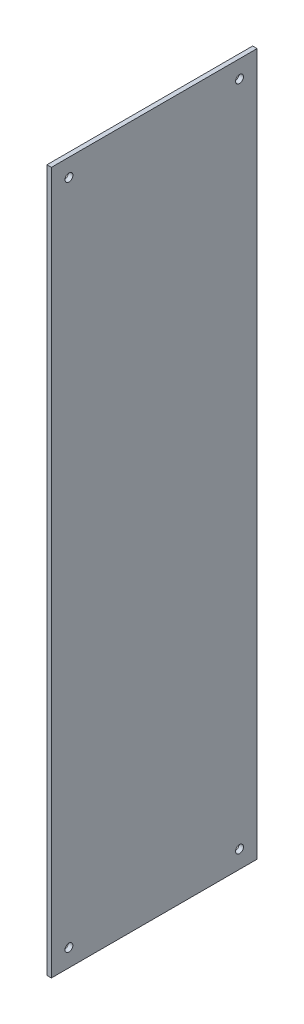
ISO-10303-21;
HEADER;
FILE_DESCRIPTION(('STEP AP214'),'2;1');
FILE_NAME('part.step','',(''),(''),'','','');
FILE_SCHEMA(('AUTOMOTIVE_DESIGN { 1 0 10303 214 1 1 1 1 }'));
ENDSEC;
DATA;
#1=APPLICATION_CONTEXT('core data for automotive mechanical design processes');
#2=APPLICATION_PROTOCOL_DEFINITION('international standard','automotive_design',2000,#1);
#3=PRODUCT_CONTEXT('',#1,'mechanical');
#4=PRODUCT('Part','Part','',(#3));
#5=PRODUCT_RELATED_PRODUCT_CATEGORY('part','',(#4));
#6=PRODUCT_DEFINITION_FORMATION('','',#4);
#7=PRODUCT_DEFINITION_CONTEXT('part definition',#1,'design');
#8=PRODUCT_DEFINITION('design','',#6,#7);
#9=PRODUCT_DEFINITION_SHAPE('','',#8);
#10=(LENGTH_UNIT() NAMED_UNIT(*) SI_UNIT(.MILLI.,.METRE.));
#11=(NAMED_UNIT(*) PLANE_ANGLE_UNIT() SI_UNIT($,.RADIAN.));
#12=(NAMED_UNIT(*) SI_UNIT($,.STERADIAN.) SOLID_ANGLE_UNIT());
#13=UNCERTAINTY_MEASURE_WITH_UNIT(LENGTH_MEASURE(1.E-05),#10,'distance_accuracy_value','');
#14=(GEOMETRIC_REPRESENTATION_CONTEXT(3) GLOBAL_UNCERTAINTY_ASSIGNED_CONTEXT((#13)) GLOBAL_UNIT_ASSIGNED_CONTEXT((#10,
#11,#12)) REPRESENTATION_CONTEXT('',''));
#15=CARTESIAN_POINT('',(0.,0.,0.));
#16=DIRECTION('',(0.,0.,1.));
#17=DIRECTION('',(1.,0.,0.));
#18=AXIS2_PLACEMENT_3D('',#15,#16,#17);
#19=CARTESIAN_POINT('',(3.175,0.,0.));
#20=DIRECTION('',(-1.,0.,0.));
#21=DIRECTION('',(0.,0.,1.));
#22=AXIS2_PLACEMENT_3D('',#19,#20,#21);
#23=PLANE('',#22);
#24=DIRECTION('',(0.,0.,1.));
#25=VECTOR('',#24,1.);
#26=CARTESIAN_POINT('',(3.175,250.,-73.25));
#27=LINE('',#26,#25);
#28=CARTESIAN_POINT('',(3.175,250.,-73.25));
#29=VERTEX_POINT('',#28);
#30=CARTESIAN_POINT('',(3.175,250.,73.25));
#31=VERTEX_POINT('',#30);
#32=EDGE_CURVE('E98',#29,#31,#27,.T.);
#33=ORIENTED_EDGE('',*,*,#32,.T.);
#34=DIRECTION('',(0.,-1.,0.));
#35=VECTOR('',#34,1.);
#36=CARTESIAN_POINT('',(3.175,-250.,73.25));
#37=LINE('',#36,#35);
#38=CARTESIAN_POINT('',(3.175,-250.,73.25));
#39=VERTEX_POINT('',#38);
#40=EDGE_CURVE('E93',#31,#39,#37,.T.);
#41=ORIENTED_EDGE('',*,*,#40,.T.);
#42=DIRECTION('',(0.,0.,-1.));
#43=VECTOR('',#42,1.);
#44=CARTESIAN_POINT('',(3.175,-250.,-73.25));
#45=LINE('',#44,#43);
#46=CARTESIAN_POINT('',(3.175,-250.,-73.25));
#47=VERTEX_POINT('',#46);
#48=EDGE_CURVE('E96',#39,#47,#45,.T.);
#49=ORIENTED_EDGE('',*,*,#48,.T.);
#50=DIRECTION('',(0.,1.,0.));
#51=VECTOR('',#50,1.);
#52=CARTESIAN_POINT('',(3.175,-250.,-73.25));
#53=LINE('',#52,#51);
#54=EDGE_CURVE('E63',#47,#29,#53,.T.);
#55=ORIENTED_EDGE('',*,*,#54,.T.);
#56=EDGE_LOOP('',(#33,#41,#49,#55));
#57=FACE_BOUND('',#56,.T.);
#58=CARTESIAN_POINT('',(3.175,-237.5,60.75));
#59=DIRECTION('',(1.,0.,0.));
#60=DIRECTION('',(0.,0.,-1.));
#61=AXIS2_PLACEMENT_3D('',#58,#59,#60);
#62=CIRCLE('',#61,2.8);
#63=CARTESIAN_POINT('',(3.175,-237.5,57.95));
#64=VERTEX_POINT('',#63);
#65=EDGE_CURVE('E118',#64,#64,#62,.T.);
#66=ORIENTED_EDGE('',*,*,#65,.F.);
#67=EDGE_LOOP('',(#66));
#68=FACE_BOUND('',#67,.T.);
#69=CARTESIAN_POINT('',(3.175,-237.5,-60.75));
#70=DIRECTION('',(1.,0.,0.));
#71=DIRECTION('',(0.,0.,-1.));
#72=AXIS2_PLACEMENT_3D('',#69,#70,#71);
#73=CIRCLE('',#72,2.8);
#74=CARTESIAN_POINT('',(3.175,-237.5,-63.55));
#75=VERTEX_POINT('',#74);
#76=EDGE_CURVE('E140',#75,#75,#73,.T.);
#77=ORIENTED_EDGE('',*,*,#76,.F.);
#78=EDGE_LOOP('',(#77));
#79=FACE_BOUND('',#78,.T.);
#80=CARTESIAN_POINT('',(3.175,237.5,60.75));
#81=DIRECTION('',(1.,0.,0.));
#82=DIRECTION('',(0.,0.,-1.));
#83=AXIS2_PLACEMENT_3D('',#80,#81,#82);
#84=CIRCLE('',#83,2.8);
#85=CARTESIAN_POINT('',(3.175,237.5,57.95));
#86=VERTEX_POINT('',#85);
#87=EDGE_CURVE('E148',#86,#86,#84,.T.);
#88=ORIENTED_EDGE('',*,*,#87,.F.);
#89=EDGE_LOOP('',(#88));
#90=FACE_BOUND('',#89,.T.);
#91=CARTESIAN_POINT('',(3.175,237.5,-60.75));
#92=DIRECTION('',(1.,0.,0.));
#93=DIRECTION('',(0.,0.,-1.));
#94=AXIS2_PLACEMENT_3D('',#91,#92,#93);
#95=CIRCLE('',#94,2.8);
#96=CARTESIAN_POINT('',(3.175,237.5,-63.55));
#97=VERTEX_POINT('',#96);
#98=EDGE_CURVE('E156',#97,#97,#95,.T.);
#99=ORIENTED_EDGE('',*,*,#98,.F.);
#100=EDGE_LOOP('',(#99));
#101=FACE_BOUND('',#100,.T.);
#102=ADVANCED_FACE('F45',(#57,#68,#79,#90,#101),#23,.F.);
#103=CARTESIAN_POINT('',(0.,0.,0.));
#104=DIRECTION('',(-1.,0.,0.));
#105=DIRECTION('',(0.,0.,1.));
#106=AXIS2_PLACEMENT_3D('',#103,#104,#105);
#107=PLANE('',#106);
#108=CARTESIAN_POINT('',(0.,237.5,60.75));
#109=DIRECTION('',(1.,0.,0.));
#110=DIRECTION('',(0.,0.,-1.));
#111=AXIS2_PLACEMENT_3D('',#108,#109,#110);
#112=CIRCLE('',#111,2.8);
#113=CARTESIAN_POINT('',(0.,237.5,57.95));
#114=VERTEX_POINT('',#113);
#115=EDGE_CURVE('E152',#114,#114,#112,.T.);
#116=ORIENTED_EDGE('',*,*,#115,.T.);
#117=EDGE_LOOP('',(#116));
#118=FACE_BOUND('',#117,.T.);
#119=CARTESIAN_POINT('',(0.,-237.5,60.75));
#120=DIRECTION('',(1.,0.,0.));
#121=DIRECTION('',(0.,0.,-1.));
#122=AXIS2_PLACEMENT_3D('',#119,#120,#121);
#123=CIRCLE('',#122,2.8);
#124=CARTESIAN_POINT('',(0.,-237.5,57.95));
#125=VERTEX_POINT('',#124);
#126=EDGE_CURVE('E136',#125,#125,#123,.T.);
#127=ORIENTED_EDGE('',*,*,#126,.T.);
#128=EDGE_LOOP('',(#127));
#129=FACE_BOUND('',#128,.T.);
#130=DIRECTION('',(0.,0.,1.));
#131=VECTOR('',#130,1.);
#132=CARTESIAN_POINT('',(0.,250.,-73.25));
#133=LINE('',#132,#131);
#134=CARTESIAN_POINT('',(0.,250.,-73.25));
#135=VERTEX_POINT('',#134);
#136=CARTESIAN_POINT('',(0.,250.,73.25));
#137=VERTEX_POINT('',#136);
#138=EDGE_CURVE('E114',#135,#137,#133,.T.);
#139=ORIENTED_EDGE('',*,*,#138,.F.);
#140=DIRECTION('',(0.,1.,0.));
#141=VECTOR('',#140,1.);
#142=CARTESIAN_POINT('',(0.,-250.,-73.25));
#143=LINE('',#142,#141);
#144=CARTESIAN_POINT('',(0.,-250.,-73.25));
#145=VERTEX_POINT('',#144);
#146=EDGE_CURVE('E86',#145,#135,#143,.T.);
#147=ORIENTED_EDGE('',*,*,#146,.F.);
#148=DIRECTION('',(0.,0.,-1.));
#149=VECTOR('',#148,1.);
#150=CARTESIAN_POINT('',(0.,-250.,-73.25));
#151=LINE('',#150,#149);
#152=CARTESIAN_POINT('',(0.,-250.,73.25));
#153=VERTEX_POINT('',#152);
#154=EDGE_CURVE('E80',#153,#145,#151,.T.);
#155=ORIENTED_EDGE('',*,*,#154,.F.);
#156=DIRECTION('',(0.,-1.,0.));
#157=VECTOR('',#156,1.);
#158=CARTESIAN_POINT('',(0.,-250.,73.25));
#159=LINE('',#158,#157);
#160=EDGE_CURVE('E103',#137,#153,#159,.T.);
#161=ORIENTED_EDGE('',*,*,#160,.F.);
#162=EDGE_LOOP('',(#139,#147,#155,#161));
#163=FACE_BOUND('',#162,.T.);
#164=CARTESIAN_POINT('',(0.,-237.5,-60.75));
#165=DIRECTION('',(1.,0.,0.));
#166=DIRECTION('',(0.,0.,-1.));
#167=AXIS2_PLACEMENT_3D('',#164,#165,#166);
#168=CIRCLE('',#167,2.8);
#169=CARTESIAN_POINT('',(0.,-237.5,-63.55));
#170=VERTEX_POINT('',#169);
#171=EDGE_CURVE('E144',#170,#170,#168,.T.);
#172=ORIENTED_EDGE('',*,*,#171,.T.);
#173=EDGE_LOOP('',(#172));
#174=FACE_BOUND('',#173,.T.);
#175=CARTESIAN_POINT('',(0.,237.5,-60.75));
#176=DIRECTION('',(1.,0.,0.));
#177=DIRECTION('',(0.,0.,-1.));
#178=AXIS2_PLACEMENT_3D('',#175,#176,#177);
#179=CIRCLE('',#178,2.8);
#180=CARTESIAN_POINT('',(0.,237.5,-63.55));
#181=VERTEX_POINT('',#180);
#182=EDGE_CURVE('E160',#181,#181,#179,.T.);
#183=ORIENTED_EDGE('',*,*,#182,.T.);
#184=EDGE_LOOP('',(#183));
#185=FACE_BOUND('',#184,.T.);
#186=ADVANCED_FACE('F131',(#118,#129,#163,#174,#185),#107,.T.);
#187=CARTESIAN_POINT('',(3.175,250.,-73.25));
#188=DIRECTION('',(0.,-1.,0.));
#189=DIRECTION('',(0.,0.,-1.));
#190=AXIS2_PLACEMENT_3D('',#187,#188,#189);
#191=PLANE('',#190);
#192=ORIENTED_EDGE('',*,*,#138,.T.);
#193=DIRECTION('',(-1.,0.,0.));
#194=VECTOR('',#193,1.);
#195=CARTESIAN_POINT('',(3.175,250.,73.25));
#196=LINE('',#195,#194);
#197=EDGE_CURVE('E11',#31,#137,#196,.T.);
#198=ORIENTED_EDGE('',*,*,#197,.F.);
#199=ORIENTED_EDGE('',*,*,#32,.F.);
#200=DIRECTION('',(-1.,0.,0.));
#201=VECTOR('',#200,1.);
#202=CARTESIAN_POINT('',(3.175,250.,-73.25));
#203=LINE('',#202,#201);
#204=EDGE_CURVE('E110',#29,#135,#203,.T.);
#205=ORIENTED_EDGE('',*,*,#204,.T.);
#206=EDGE_LOOP('',(#192,#198,#199,#205));
#207=FACE_BOUND('',#206,.T.);
#208=ADVANCED_FACE('F47',(#207),#191,.F.);
#209=CARTESIAN_POINT('',(3.175,-250.,73.25));
#210=DIRECTION('',(0.,0.,-1.));
#211=DIRECTION('',(-1.,0.,0.));
#212=AXIS2_PLACEMENT_3D('',#209,#210,#211);
#213=PLANE('',#212);
#214=ORIENTED_EDGE('',*,*,#160,.T.);
#215=DIRECTION('',(-1.,0.,0.));
#216=VECTOR('',#215,1.);
#217=CARTESIAN_POINT('',(3.175,-250.,73.25));
#218=LINE('',#217,#216);
#219=EDGE_CURVE('E55',#39,#153,#218,.T.);
#220=ORIENTED_EDGE('',*,*,#219,.F.);
#221=ORIENTED_EDGE('',*,*,#40,.F.);
#222=ORIENTED_EDGE('',*,*,#197,.T.);
#223=EDGE_LOOP('',(#214,#220,#221,#222));
#224=FACE_BOUND('',#223,.T.);
#225=ADVANCED_FACE('F102',(#224),#213,.F.);
#226=CARTESIAN_POINT('',(3.175,-250.,-73.25));
#227=DIRECTION('',(0.,1.,0.));
#228=DIRECTION('',(0.,0.,1.));
#229=AXIS2_PLACEMENT_3D('',#226,#227,#228);
#230=PLANE('',#229);
#231=ORIENTED_EDGE('',*,*,#154,.T.);
#232=DIRECTION('',(-1.,0.,0.));
#233=VECTOR('',#232,1.);
#234=CARTESIAN_POINT('',(3.175,-250.,-73.25));
#235=LINE('',#234,#233);
#236=EDGE_CURVE('E105',#47,#145,#235,.T.);
#237=ORIENTED_EDGE('',*,*,#236,.F.);
#238=ORIENTED_EDGE('',*,*,#48,.F.);
#239=ORIENTED_EDGE('',*,*,#219,.T.);
#240=EDGE_LOOP('',(#231,#237,#238,#239));
#241=FACE_BOUND('',#240,.T.);
#242=ADVANCED_FACE('F106',(#241),#230,.F.);
#243=CARTESIAN_POINT('',(3.175,-250.,-73.25));
#244=DIRECTION('',(0.,0.,1.));
#245=DIRECTION('',(1.,0.,0.));
#246=AXIS2_PLACEMENT_3D('',#243,#244,#245);
#247=PLANE('',#246);
#248=ORIENTED_EDGE('',*,*,#146,.T.);
#249=ORIENTED_EDGE('',*,*,#204,.F.);
#250=ORIENTED_EDGE('',*,*,#54,.F.);
#251=ORIENTED_EDGE('',*,*,#236,.T.);
#252=EDGE_LOOP('',(#248,#249,#250,#251));
#253=FACE_BOUND('',#252,.T.);
#254=ADVANCED_FACE('F128',(#253),#247,.F.);
#255=CARTESIAN_POINT('',(3.175,-237.5,60.75));
#256=DIRECTION('',(-1.,0.,0.));
#257=DIRECTION('',(0.,0.,1.));
#258=AXIS2_PLACEMENT_3D('',#255,#256,#257);
#259=CYLINDRICAL_SURFACE('',#258,2.8);
#260=ORIENTED_EDGE('',*,*,#65,.T.);
#261=EDGE_LOOP('',(#260));
#262=FACE_BOUND('',#261,.T.);
#263=ORIENTED_EDGE('',*,*,#126,.F.);
#264=EDGE_LOOP('',(#263));
#265=FACE_BOUND('',#264,.T.);
#266=ADVANCED_FACE('F179',(#262,#265),#259,.F.);
#267=CARTESIAN_POINT('',(3.175,-237.5,-60.75));
#268=DIRECTION('',(-1.,0.,0.));
#269=DIRECTION('',(0.,0.,1.));
#270=AXIS2_PLACEMENT_3D('',#267,#268,#269);
#271=CYLINDRICAL_SURFACE('',#270,2.8);
#272=ORIENTED_EDGE('',*,*,#76,.T.);
#273=EDGE_LOOP('',(#272));
#274=FACE_BOUND('',#273,.T.);
#275=ORIENTED_EDGE('',*,*,#171,.F.);
#276=EDGE_LOOP('',(#275));
#277=FACE_BOUND('',#276,.T.);
#278=ADVANCED_FACE('F224',(#274,#277),#271,.F.);
#279=CARTESIAN_POINT('',(3.175,237.5,60.75));
#280=DIRECTION('',(-1.,0.,0.));
#281=DIRECTION('',(0.,0.,1.));
#282=AXIS2_PLACEMENT_3D('',#279,#280,#281);
#283=CYLINDRICAL_SURFACE('',#282,2.8);
#284=ORIENTED_EDGE('',*,*,#87,.T.);
#285=EDGE_LOOP('',(#284));
#286=FACE_BOUND('',#285,.T.);
#287=ORIENTED_EDGE('',*,*,#115,.F.);
#288=EDGE_LOOP('',(#287));
#289=FACE_BOUND('',#288,.T.);
#290=ADVANCED_FACE('F232',(#286,#289),#283,.F.);
#291=CARTESIAN_POINT('',(3.175,237.5,-60.75));
#292=DIRECTION('',(-1.,0.,0.));
#293=DIRECTION('',(0.,0.,1.));
#294=AXIS2_PLACEMENT_3D('',#291,#292,#293);
#295=CYLINDRICAL_SURFACE('',#294,2.8);
#296=ORIENTED_EDGE('',*,*,#98,.T.);
#297=EDGE_LOOP('',(#296));
#298=FACE_BOUND('',#297,.T.);
#299=ORIENTED_EDGE('',*,*,#182,.F.);
#300=EDGE_LOOP('',(#299));
#301=FACE_BOUND('',#300,.T.);
#302=ADVANCED_FACE('F168',(#298,#301),#295,.F.);
#303=CLOSED_SHELL('',(#102,#186,#208,#225,#242,#254,#266,#278,#290,#302));
#304=MANIFOLD_SOLID_BREP('B2',#303);
#305=ADVANCED_BREP_SHAPE_REPRESENTATION('',(#18,#304),#14);
#306=SHAPE_DEFINITION_REPRESENTATION(#9,#305);
ENDSEC;
END-ISO-10303-21;
